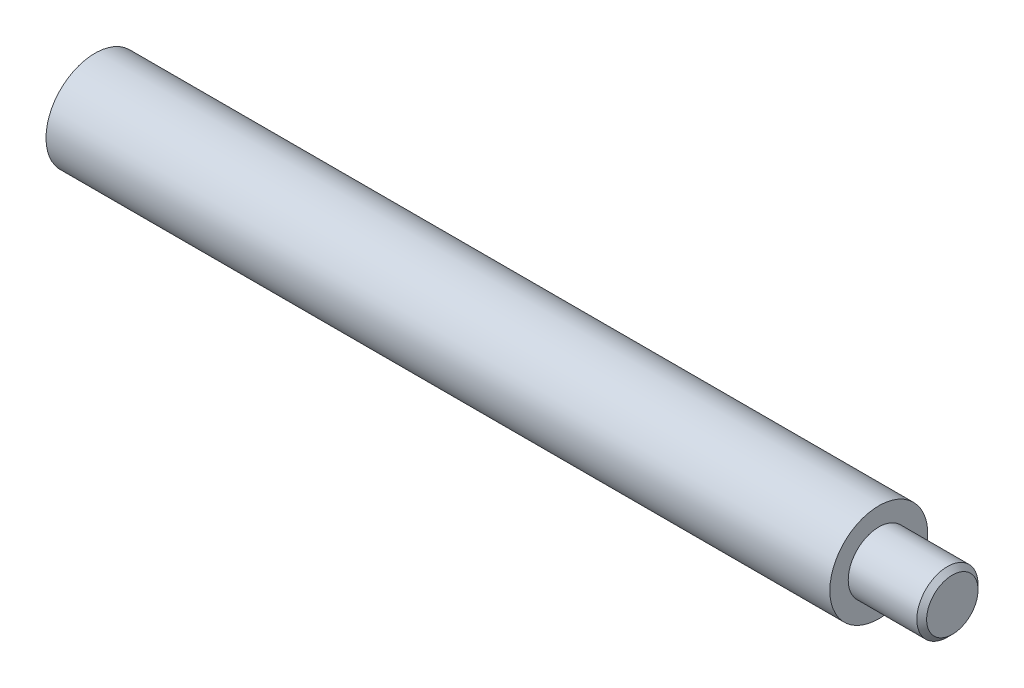
ISO-10303-21;
HEADER;
FILE_DESCRIPTION(('STEP AP214'),'2;1');
FILE_NAME('part.step','',(''),(''),'','','');
FILE_SCHEMA(('AUTOMOTIVE_DESIGN { 1 0 10303 214 1 1 1 1 }'));
ENDSEC;
DATA;
#1=APPLICATION_CONTEXT('core data for automotive mechanical design processes');
#2=APPLICATION_PROTOCOL_DEFINITION('international standard','automotive_design',2000,#1);
#3=PRODUCT_CONTEXT('',#1,'mechanical');
#4=PRODUCT('Part','Part','',(#3));
#5=PRODUCT_RELATED_PRODUCT_CATEGORY('part','',(#4));
#6=PRODUCT_DEFINITION_FORMATION('','',#4);
#7=PRODUCT_DEFINITION_CONTEXT('part definition',#1,'design');
#8=PRODUCT_DEFINITION('design','',#6,#7);
#9=PRODUCT_DEFINITION_SHAPE('','',#8);
#10=(LENGTH_UNIT() NAMED_UNIT(*) SI_UNIT(.MILLI.,.METRE.));
#11=(NAMED_UNIT(*) PLANE_ANGLE_UNIT() SI_UNIT($,.RADIAN.));
#12=(NAMED_UNIT(*) SI_UNIT($,.STERADIAN.) SOLID_ANGLE_UNIT());
#13=UNCERTAINTY_MEASURE_WITH_UNIT(LENGTH_MEASURE(1.E-05),#10,'distance_accuracy_value','');
#14=(GEOMETRIC_REPRESENTATION_CONTEXT(3) GLOBAL_UNCERTAINTY_ASSIGNED_CONTEXT((#13)) GLOBAL_UNIT_ASSIGNED_CONTEXT((#10,
#11,#12)) REPRESENTATION_CONTEXT('',''));
#15=CARTESIAN_POINT('',(0.,0.,0.));
#16=DIRECTION('',(0.,0.,1.));
#17=DIRECTION('',(1.,0.,0.));
#18=AXIS2_PLACEMENT_3D('',#15,#16,#17);
#19=CARTESIAN_POINT('',(-16.,0.,0.));
#20=DIRECTION('',(1.,0.,0.));
#21=DIRECTION('',(0.,0.,-1.));
#22=AXIS2_PLACEMENT_3D('',#19,#20,#21);
#23=PLANE('',#22);
#24=CARTESIAN_POINT('',(-16.,0.,0.));
#25=DIRECTION('',(-1.,0.,0.));
#26=DIRECTION('',(0.,0.,1.));
#27=AXIS2_PLACEMENT_3D('',#24,#25,#26);
#28=CIRCLE('',#27,1.24999999999999);
#29=CARTESIAN_POINT('',(-16.,0.,1.24999999999999));
#30=VERTEX_POINT('',#29);
#31=EDGE_CURVE('E65',#30,#30,#28,.T.);
#32=ORIENTED_EDGE('',*,*,#31,.F.);
#33=EDGE_LOOP('',(#32));
#34=FACE_BOUND('',#33,.T.);
#35=CARTESIAN_POINT('',(-16.,0.,0.));
#36=DIRECTION('',(-1.,0.,0.));
#37=DIRECTION('',(0.,0.,1.));
#38=AXIS2_PLACEMENT_3D('',#35,#36,#37);
#39=CIRCLE('',#38,1.99999999999999);
#40=CARTESIAN_POINT('',(-16.,0.,1.99999999999999));
#41=VERTEX_POINT('',#40);
#42=EDGE_CURVE('E64',#41,#41,#39,.T.);
#43=ORIENTED_EDGE('',*,*,#42,.T.);
#44=EDGE_LOOP('',(#43));
#45=FACE_BOUND('',#44,.T.);
#46=ADVANCED_FACE('F42',(#34,#45),#23,.F.);
#47=CARTESIAN_POINT('',(19.,0.,0.));
#48=DIRECTION('',(-1.,0.,0.));
#49=DIRECTION('',(0.,0.,1.));
#50=AXIS2_PLACEMENT_3D('',#47,#48,#49);
#51=PLANE('',#50);
#52=CARTESIAN_POINT('',(19.,0.,0.));
#53=DIRECTION('',(-1.,0.,0.));
#54=DIRECTION('',(0.,0.,1.));
#55=AXIS2_PLACEMENT_3D('',#52,#53,#54);
#56=CIRCLE('',#55,1.05);
#57=CARTESIAN_POINT('',(19.,0.,1.05));
#58=VERTEX_POINT('',#57);
#59=EDGE_CURVE('E11',#58,#58,#56,.F.);
#60=ORIENTED_EDGE('',*,*,#59,.T.);
#61=EDGE_LOOP('',(#60));
#62=FACE_BOUND('',#61,.T.);
#63=ADVANCED_FACE('F96',(#62),#51,.F.);
#64=CARTESIAN_POINT('',(0.,0.,0.));
#65=DIRECTION('',(-1.,0.,0.));
#66=DIRECTION('',(0.,0.,1.));
#67=AXIS2_PLACEMENT_3D('',#64,#65,#66);
#68=CYLINDRICAL_SURFACE('',#67,1.25);
#69=CARTESIAN_POINT('',(18.8,0.,0.));
#70=DIRECTION('',(-1.,0.,0.));
#71=DIRECTION('',(0.,0.,1.));
#72=AXIS2_PLACEMENT_3D('',#69,#70,#71);
#73=CIRCLE('',#72,1.25);
#74=CARTESIAN_POINT('',(18.8,0.,1.25));
#75=VERTEX_POINT('',#74);
#76=EDGE_CURVE('E50',#75,#75,#73,.T.);
#77=ORIENTED_EDGE('',*,*,#76,.T.);
#78=EDGE_LOOP('',(#77));
#79=FACE_BOUND('',#78,.T.);
#80=CARTESIAN_POINT('',(16.,0.,0.));
#81=DIRECTION('',(-1.,0.,0.));
#82=DIRECTION('',(0.,0.,1.));
#83=AXIS2_PLACEMENT_3D('',#80,#81,#82);
#84=CIRCLE('',#83,1.25);
#85=CARTESIAN_POINT('',(16.,0.,1.25));
#86=VERTEX_POINT('',#85);
#87=EDGE_CURVE('E79',#86,#86,#84,.T.);
#88=ORIENTED_EDGE('',*,*,#87,.F.);
#89=EDGE_LOOP('',(#88));
#90=FACE_BOUND('',#89,.T.);
#91=ADVANCED_FACE('F85',(#79,#90),#68,.T.);
#92=CARTESIAN_POINT('',(16.,1.25,0.));
#93=DIRECTION('',(-1.,0.,0.));
#94=DIRECTION('',(0.,0.,1.));
#95=AXIS2_PLACEMENT_3D('',#92,#93,#94);
#96=PLANE('',#95);
#97=CARTESIAN_POINT('',(16.,0.,0.));
#98=DIRECTION('',(-1.,0.,0.));
#99=DIRECTION('',(0.,0.,1.));
#100=AXIS2_PLACEMENT_3D('',#97,#98,#99);
#101=CIRCLE('',#100,1.99999999999999);
#102=CARTESIAN_POINT('',(16.,0.,1.99999999999999));
#103=VERTEX_POINT('',#102);
#104=EDGE_CURVE('E70',#103,#103,#101,.T.);
#105=ORIENTED_EDGE('',*,*,#104,.F.);
#106=EDGE_LOOP('',(#105));
#107=FACE_BOUND('',#106,.T.);
#108=ORIENTED_EDGE('',*,*,#87,.T.);
#109=EDGE_LOOP('',(#108));
#110=FACE_BOUND('',#109,.T.);
#111=ADVANCED_FACE('F108',(#107,#110),#96,.F.);
#112=CARTESIAN_POINT('',(0.,0.,0.));
#113=DIRECTION('',(-1.,0.,0.));
#114=DIRECTION('',(0.,0.,1.));
#115=AXIS2_PLACEMENT_3D('',#112,#113,#114);
#116=CYLINDRICAL_SURFACE('',#115,1.99999999999999);
#117=ORIENTED_EDGE('',*,*,#42,.F.);
#118=EDGE_LOOP('',(#117));
#119=FACE_BOUND('',#118,.T.);
#120=ORIENTED_EDGE('',*,*,#104,.T.);
#121=EDGE_LOOP('',(#120));
#122=FACE_BOUND('',#121,.T.);
#123=ADVANCED_FACE('F57',(#119,#122),#116,.T.);
#124=CARTESIAN_POINT('',(-9.5,0.,0.));
#125=DIRECTION('',(-1.,0.,0.));
#126=DIRECTION('',(0.,0.,1.));
#127=AXIS2_PLACEMENT_3D('',#124,#125,#126);
#128=CONICAL_SURFACE('',#127,1.25,1.02974425867665);
#129=CARTESIAN_POINT('',(-8.74892422621555,0.,0.));
#130=VERTEX_POINT('',#129);
#131=VERTEX_LOOP('',#130);
#132=FACE_BOUND('',#131,.T.);
#133=CARTESIAN_POINT('',(-9.5,0.,0.));
#134=DIRECTION('',(-1.,0.,0.));
#135=DIRECTION('',(0.,0.,1.));
#136=AXIS2_PLACEMENT_3D('',#133,#134,#135);
#137=CIRCLE('',#136,1.25);
#138=CARTESIAN_POINT('',(-9.5,0.,1.25));
#139=VERTEX_POINT('',#138);
#140=EDGE_CURVE('E61',#139,#139,#137,.T.);
#141=ORIENTED_EDGE('',*,*,#140,.T.);
#142=EDGE_LOOP('',(#141));
#143=FACE_BOUND('',#142,.T.);
#144=ADVANCED_FACE('F53',(#132,#143),#128,.F.);
#145=CARTESIAN_POINT('',(-16.,0.,0.));
#146=DIRECTION('',(-1.,0.,0.));
#147=DIRECTION('',(0.,0.,1.));
#148=AXIS2_PLACEMENT_3D('',#145,#146,#147);
#149=CYLINDRICAL_SURFACE('',#148,1.24999999999999);
#150=ORIENTED_EDGE('',*,*,#140,.F.);
#151=EDGE_LOOP('',(#150));
#152=FACE_BOUND('',#151,.T.);
#153=ORIENTED_EDGE('',*,*,#31,.T.);
#154=EDGE_LOOP('',(#153));
#155=FACE_BOUND('',#154,.T.);
#156=ADVANCED_FACE('F56',(#152,#155),#149,.F.);
#157=CARTESIAN_POINT('',(18.8,0.,0.));
#158=DIRECTION('',(-1.,0.,0.));
#159=DIRECTION('',(0.,0.,1.));
#160=AXIS2_PLACEMENT_3D('',#157,#158,#159);
#161=CONICAL_SURFACE('',#160,1.25,0.785398163397446);
#162=ORIENTED_EDGE('',*,*,#59,.F.);
#163=EDGE_LOOP('',(#162));
#164=FACE_BOUND('',#163,.T.);
#165=ORIENTED_EDGE('',*,*,#76,.F.);
#166=EDGE_LOOP('',(#165));
#167=FACE_BOUND('',#166,.T.);
#168=ADVANCED_FACE('F44',(#164,#167),#161,.T.);
#169=CLOSED_SHELL('',(#46,#63,#91,#111,#123,#144,#156,#168));
#170=MANIFOLD_SOLID_BREP('B2',#169);
#171=ADVANCED_BREP_SHAPE_REPRESENTATION('',(#18,#170),#14);
#172=SHAPE_DEFINITION_REPRESENTATION(#9,#171);
ENDSEC;
END-ISO-10303-21;
